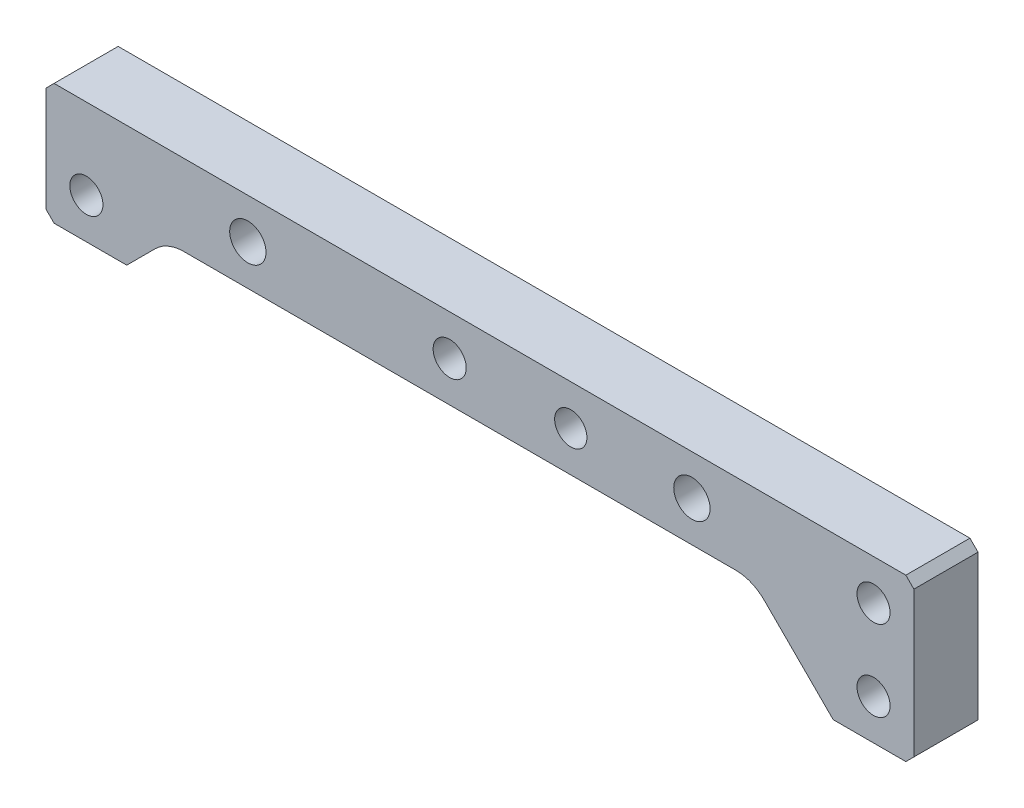
ISO-10303-21;
HEADER;
FILE_DESCRIPTION(('STEP AP214'),'2;1');
FILE_NAME('part.step','',(''),(''),'','','');
FILE_SCHEMA(('AUTOMOTIVE_DESIGN { 1 0 10303 214 1 1 1 1 }'));
ENDSEC;
DATA;
#1=APPLICATION_CONTEXT('core data for automotive mechanical design processes');
#2=APPLICATION_PROTOCOL_DEFINITION('international standard','automotive_design',2000,#1);
#3=PRODUCT_CONTEXT('',#1,'mechanical');
#4=PRODUCT('Part','Part','',(#3));
#5=PRODUCT_RELATED_PRODUCT_CATEGORY('part','',(#4));
#6=PRODUCT_DEFINITION_FORMATION('','',#4);
#7=PRODUCT_DEFINITION_CONTEXT('part definition',#1,'design');
#8=PRODUCT_DEFINITION('design','',#6,#7);
#9=PRODUCT_DEFINITION_SHAPE('','',#8);
#10=(LENGTH_UNIT() NAMED_UNIT(*) SI_UNIT(.MILLI.,.METRE.));
#11=(NAMED_UNIT(*) PLANE_ANGLE_UNIT() SI_UNIT($,.RADIAN.));
#12=(NAMED_UNIT(*) SI_UNIT($,.STERADIAN.) SOLID_ANGLE_UNIT());
#13=UNCERTAINTY_MEASURE_WITH_UNIT(LENGTH_MEASURE(1.E-05),#10,'distance_accuracy_value','');
#14=(GEOMETRIC_REPRESENTATION_CONTEXT(3) GLOBAL_UNCERTAINTY_ASSIGNED_CONTEXT((#13)) GLOBAL_UNIT_ASSIGNED_CONTEXT((#10,
#11,#12)) REPRESENTATION_CONTEXT('',''));
#15=CARTESIAN_POINT('',(0.,0.,0.));
#16=DIRECTION('',(0.,0.,1.));
#17=DIRECTION('',(1.,0.,0.));
#18=AXIS2_PLACEMENT_3D('',#15,#16,#17);
#19=CARTESIAN_POINT('',(0.,0.,15.875));
#20=DIRECTION('',(0.,0.,-1.));
#21=DIRECTION('',(-1.,0.,0.));
#22=AXIS2_PLACEMENT_3D('',#19,#20,#21);
#23=PLANE('',#22);
#24=CARTESIAN_POINT('',(-80.,0.,15.875));
#25=DIRECTION('',(0.,0.,-1.));
#26=DIRECTION('',(-1.,0.,0.));
#27=AXIS2_PLACEMENT_3D('',#24,#25,#26);
#28=CIRCLE('',#27,4.5);
#29=CARTESIAN_POINT('',(-84.5,0.,15.875));
#30=VERTEX_POINT('',#29);
#31=EDGE_CURVE('E616',#30,#30,#28,.T.);
#32=ORIENTED_EDGE('',*,*,#31,.T.);
#33=EDGE_LOOP('',(#32));
#34=FACE_BOUND('',#33,.T.);
#35=CARTESIAN_POINT('',(30.,0.,15.875));
#36=DIRECTION('',(0.,0.,-1.));
#37=DIRECTION('',(-1.,0.,0.));
#38=AXIS2_PLACEMENT_3D('',#35,#36,#37);
#39=CIRCLE('',#38,4.5);
#40=CARTESIAN_POINT('',(25.5,0.,15.875));
#41=VERTEX_POINT('',#40);
#42=EDGE_CURVE('E605',#41,#41,#39,.T.);
#43=ORIENTED_EDGE('',*,*,#42,.T.);
#44=EDGE_LOOP('',(#43));
#45=FACE_BOUND('',#44,.T.);
#46=DIRECTION('',(-1.,0.,0.));
#47=VECTOR('',#46,1.);
#48=CARTESIAN_POINT('',(0.,10.,15.875));
#49=LINE('',#48,#47);
#50=CARTESIAN_POINT('',(82.9999999999999,10.,15.875));
#51=VERTEX_POINT('',#50);
#52=CARTESIAN_POINT('',(-128.,9.99999999999994,15.875));
#53=VERTEX_POINT('',#52);
#54=EDGE_CURVE('E237',#51,#53,#49,.T.);
#55=ORIENTED_EDGE('',*,*,#54,.T.);
#56=DIRECTION('',(0.707106781186552,0.707106781186543,0.));
#57=VECTOR('',#56,1.);
#58=CARTESIAN_POINT('',(-130.,8.,15.875));
#59=LINE('',#58,#57);
#60=CARTESIAN_POINT('',(-130.,8.,15.875));
#61=VERTEX_POINT('',#60);
#62=EDGE_CURVE('E272',#53,#61,#59,.F.);
#63=ORIENTED_EDGE('',*,*,#62,.T.);
#64=DIRECTION('',(0.,-1.,0.));
#65=VECTOR('',#64,1.);
#66=CARTESIAN_POINT('',(-130.,10.,15.875));
#67=LINE('',#66,#65);
#68=CARTESIAN_POINT('',(-130.,-18.,15.875));
#69=VERTEX_POINT('',#68);
#70=EDGE_CURVE('E155',#61,#69,#67,.T.);
#71=ORIENTED_EDGE('',*,*,#70,.T.);
#72=DIRECTION('',(-0.707106781186552,0.707106781186543,0.));
#73=VECTOR('',#72,1.);
#74=CARTESIAN_POINT('',(-128.,-20.,15.875));
#75=LINE('',#74,#73);
#76=CARTESIAN_POINT('',(-128.,-20.,15.875));
#77=VERTEX_POINT('',#76);
#78=EDGE_CURVE('E149',#69,#77,#75,.F.);
#79=ORIENTED_EDGE('',*,*,#78,.T.);
#80=DIRECTION('',(1.,0.,0.));
#81=VECTOR('',#80,1.);
#82=CARTESIAN_POINT('',(-110.,-20.,15.875));
#83=LINE('',#82,#81);
#84=CARTESIAN_POINT('',(-110.,-20.,15.875));
#85=VERTEX_POINT('',#84);
#86=EDGE_CURVE('E140',#77,#85,#83,.T.);
#87=ORIENTED_EDGE('',*,*,#86,.T.);
#88=DIRECTION('',(-0.707106781186551,-0.707106781186544,0.));
#89=VECTOR('',#88,1.);
#90=CARTESIAN_POINT('',(-44.9999999999995,44.9999999999999,15.875));
#91=LINE('',#90,#89);
#92=CARTESIAN_POINT('',(-102.928932188134,-12.9289321881345,15.875));
#93=VERTEX_POINT('',#92);
#94=EDGE_CURVE('E145',#85,#93,#91,.F.);
#95=ORIENTED_EDGE('',*,*,#94,.T.);
#96=CARTESIAN_POINT('',(-95.857864376269,-20.,15.875));
#97=DIRECTION('',(0.,0.,-1.));
#98=DIRECTION('',(-1.,0.,0.));
#99=AXIS2_PLACEMENT_3D('',#96,#97,#98);
#100=CIRCLE('',#99,10.);
#101=CARTESIAN_POINT('',(-95.857864376269,-10.,15.875));
#102=VERTEX_POINT('',#101);
#103=EDGE_CURVE('E195',#93,#102,#100,.T.);
#104=ORIENTED_EDGE('',*,*,#103,.T.);
#105=DIRECTION('',(1.,0.,0.));
#106=VECTOR('',#105,1.);
#107=CARTESIAN_POINT('',(0.,-10.,15.875));
#108=LINE('',#107,#106);
#109=CARTESIAN_POINT('',(40.8578643762691,-10.,15.875));
#110=VERTEX_POINT('',#109);
#111=EDGE_CURVE('E154',#102,#110,#108,.T.);
#112=ORIENTED_EDGE('',*,*,#111,.T.);
#113=CARTESIAN_POINT('',(40.8578643762691,-20.,15.875));
#114=DIRECTION('',(0.,0.,-1.));
#115=DIRECTION('',(-1.,0.,0.));
#116=AXIS2_PLACEMENT_3D('',#113,#114,#115);
#117=CIRCLE('',#116,10.);
#118=CARTESIAN_POINT('',(47.9289321881346,-12.9289321881345,15.875));
#119=VERTEX_POINT('',#118);
#120=EDGE_CURVE('E50',#110,#119,#117,.T.);
#121=ORIENTED_EDGE('',*,*,#120,.T.);
#122=DIRECTION('',(-0.707106781186546,0.707106781186549,0.));
#123=VECTOR('',#122,1.);
#124=CARTESIAN_POINT('',(17.5000000000001,17.5,15.875));
#125=LINE('',#124,#123);
#126=CARTESIAN_POINT('',(65.,-30.,15.875));
#127=VERTEX_POINT('',#126);
#128=EDGE_CURVE('E181',#119,#127,#125,.F.);
#129=ORIENTED_EDGE('',*,*,#128,.T.);
#130=DIRECTION('',(1.,0.,0.));
#131=VECTOR('',#130,1.);
#132=CARTESIAN_POINT('',(85.,-30.,15.875));
#133=LINE('',#132,#131);
#134=CARTESIAN_POINT('',(83.,-30.,15.875));
#135=VERTEX_POINT('',#134);
#136=EDGE_CURVE('E207',#127,#135,#133,.T.);
#137=ORIENTED_EDGE('',*,*,#136,.T.);
#138=DIRECTION('',(-0.707106781186552,-0.707106781186543,0.));
#139=VECTOR('',#138,1.);
#140=CARTESIAN_POINT('',(85.,-28.,15.875));
#141=LINE('',#140,#139);
#142=CARTESIAN_POINT('',(85.,-28.,15.875));
#143=VERTEX_POINT('',#142);
#144=EDGE_CURVE('E267',#135,#143,#141,.F.);
#145=ORIENTED_EDGE('',*,*,#144,.T.);
#146=DIRECTION('',(0.,1.,0.));
#147=VECTOR('',#146,1.);
#148=CARTESIAN_POINT('',(85.,10.,15.875));
#149=LINE('',#148,#147);
#150=CARTESIAN_POINT('',(85.,8.,15.875));
#151=VERTEX_POINT('',#150);
#152=EDGE_CURVE('E300',#143,#151,#149,.T.);
#153=ORIENTED_EDGE('',*,*,#152,.T.);
#154=DIRECTION('',(0.707106781186548,-0.707106781186548,0.));
#155=VECTOR('',#154,1.);
#156=CARTESIAN_POINT('',(82.9999999999999,10.,15.875));
#157=LINE('',#156,#155);
#158=EDGE_CURVE('E264',#151,#51,#157,.F.);
#159=ORIENTED_EDGE('',*,*,#158,.T.);
#160=EDGE_LOOP('',(#55,#63,#71,#79,#87,#95,#104,#112,#121,#129,#137,#145,#153,#159));
#161=FACE_BOUND('',#160,.T.);
#162=CARTESIAN_POINT('',(0.,0.,15.875));
#163=DIRECTION('',(0.,0.,1.));
#164=DIRECTION('',(1.,0.,0.));
#165=AXIS2_PLACEMENT_3D('',#162,#163,#164);
#166=CIRCLE('',#165,4.);
#167=CARTESIAN_POINT('',(4.,0.,15.875));
#168=VERTEX_POINT('',#167);
#169=EDGE_CURVE('E545',#168,#168,#166,.T.);
#170=ORIENTED_EDGE('',*,*,#169,.F.);
#171=EDGE_LOOP('',(#170));
#172=FACE_BOUND('',#171,.T.);
#173=CARTESIAN_POINT('',(-30.,0.,15.875));
#174=DIRECTION('',(0.,0.,1.));
#175=DIRECTION('',(1.,0.,0.));
#176=AXIS2_PLACEMENT_3D('',#173,#174,#175);
#177=CIRCLE('',#176,4.1);
#178=CARTESIAN_POINT('',(-25.9,0.,15.875));
#179=VERTEX_POINT('',#178);
#180=EDGE_CURVE('E550',#179,#179,#177,.T.);
#181=ORIENTED_EDGE('',*,*,#180,.F.);
#182=EDGE_LOOP('',(#181));
#183=FACE_BOUND('',#182,.T.);
#184=CARTESIAN_POINT('',(-120.,-10.,15.875));
#185=DIRECTION('',(0.,0.,1.));
#186=DIRECTION('',(1.,0.,0.));
#187=AXIS2_PLACEMENT_3D('',#184,#185,#186);
#188=CIRCLE('',#187,4.09999999999999);
#189=CARTESIAN_POINT('',(-115.9,-10.,15.875));
#190=VERTEX_POINT('',#189);
#191=EDGE_CURVE('E583',#190,#190,#188,.T.);
#192=ORIENTED_EDGE('',*,*,#191,.F.);
#193=EDGE_LOOP('',(#192));
#194=FACE_BOUND('',#193,.T.);
#195=CARTESIAN_POINT('',(75.,0.,15.875));
#196=DIRECTION('',(0.,0.,1.));
#197=DIRECTION('',(1.,0.,0.));
#198=AXIS2_PLACEMENT_3D('',#195,#196,#197);
#199=CIRCLE('',#198,4.1);
#200=CARTESIAN_POINT('',(79.1,0.,15.875));
#201=VERTEX_POINT('',#200);
#202=EDGE_CURVE('E589',#201,#201,#199,.T.);
#203=ORIENTED_EDGE('',*,*,#202,.F.);
#204=EDGE_LOOP('',(#203));
#205=FACE_BOUND('',#204,.T.);
#206=CARTESIAN_POINT('',(75.,-20.,15.875));
#207=DIRECTION('',(0.,0.,1.));
#208=DIRECTION('',(1.,0.,0.));
#209=AXIS2_PLACEMENT_3D('',#206,#207,#208);
#210=CIRCLE('',#209,4.1);
#211=CARTESIAN_POINT('',(79.1,-20.,15.875));
#212=VERTEX_POINT('',#211);
#213=EDGE_CURVE('E597',#212,#212,#210,.T.);
#214=ORIENTED_EDGE('',*,*,#213,.F.);
#215=EDGE_LOOP('',(#214));
#216=FACE_BOUND('',#215,.T.);
#217=ADVANCED_FACE('F41',(#34,#45,#161,#172,#183,#194,#205,#216),#23,.F.);
#218=CARTESIAN_POINT('',(0.,0.,0.));
#219=DIRECTION('',(0.,0.,-1.));
#220=DIRECTION('',(-1.,0.,0.));
#221=AXIS2_PLACEMENT_3D('',#218,#219,#220);
#222=PLANE('',#221);
#223=CARTESIAN_POINT('',(-80.,0.,0.));
#224=DIRECTION('',(0.,0.,-1.));
#225=DIRECTION('',(-1.,0.,0.));
#226=AXIS2_PLACEMENT_3D('',#223,#224,#225);
#227=CIRCLE('',#226,4.5);
#228=CARTESIAN_POINT('',(-84.5,0.,0.));
#229=VERTEX_POINT('',#228);
#230=EDGE_CURVE('E619',#229,#229,#227,.T.);
#231=ORIENTED_EDGE('',*,*,#230,.F.);
#232=EDGE_LOOP('',(#231));
#233=FACE_BOUND('',#232,.T.);
#234=CARTESIAN_POINT('',(30.,0.,0.));
#235=DIRECTION('',(0.,0.,-1.));
#236=DIRECTION('',(-1.,0.,0.));
#237=AXIS2_PLACEMENT_3D('',#234,#235,#236);
#238=CIRCLE('',#237,4.5);
#239=CARTESIAN_POINT('',(25.5,0.,0.));
#240=VERTEX_POINT('',#239);
#241=EDGE_CURVE('E612',#240,#240,#238,.T.);
#242=ORIENTED_EDGE('',*,*,#241,.F.);
#243=EDGE_LOOP('',(#242));
#244=FACE_BOUND('',#243,.T.);
#245=CARTESIAN_POINT('',(75.,0.,0.));
#246=DIRECTION('',(0.,0.,1.));
#247=DIRECTION('',(1.,0.,0.));
#248=AXIS2_PLACEMENT_3D('',#245,#246,#247);
#249=CIRCLE('',#248,4.1);
#250=CARTESIAN_POINT('',(79.1,0.,0.));
#251=VERTEX_POINT('',#250);
#252=EDGE_CURVE('E593',#251,#251,#249,.T.);
#253=ORIENTED_EDGE('',*,*,#252,.T.);
#254=EDGE_LOOP('',(#253));
#255=FACE_BOUND('',#254,.T.);
#256=CARTESIAN_POINT('',(-30.,0.,0.));
#257=DIRECTION('',(0.,0.,1.));
#258=DIRECTION('',(1.,0.,0.));
#259=AXIS2_PLACEMENT_3D('',#256,#257,#258);
#260=CIRCLE('',#259,4.1);
#261=CARTESIAN_POINT('',(-25.9,0.,0.));
#262=VERTEX_POINT('',#261);
#263=EDGE_CURVE('E556',#262,#262,#260,.T.);
#264=ORIENTED_EDGE('',*,*,#263,.T.);
#265=EDGE_LOOP('',(#264));
#266=FACE_BOUND('',#265,.T.);
#267=DIRECTION('',(0.,-1.,0.));
#268=VECTOR('',#267,1.);
#269=CARTESIAN_POINT('',(-130.,10.,0.));
#270=LINE('',#269,#268);
#271=CARTESIAN_POINT('',(-130.,8.,0.));
#272=VERTEX_POINT('',#271);
#273=CARTESIAN_POINT('',(-130.,-18.,0.));
#274=VERTEX_POINT('',#273);
#275=EDGE_CURVE('E224',#272,#274,#270,.T.);
#276=ORIENTED_EDGE('',*,*,#275,.F.);
#277=DIRECTION('',(-0.707106781186552,-0.707106781186543,0.));
#278=VECTOR('',#277,1.);
#279=CARTESIAN_POINT('',(-68.9999999999991,69.0000000000001,0.));
#280=LINE('',#279,#278);
#281=CARTESIAN_POINT('',(-128.,10.,0.));
#282=VERTEX_POINT('',#281);
#283=EDGE_CURVE('E254',#272,#282,#280,.F.);
#284=ORIENTED_EDGE('',*,*,#283,.T.);
#285=DIRECTION('',(-1.,0.,0.));
#286=VECTOR('',#285,1.);
#287=CARTESIAN_POINT('',(0.,10.,0.));
#288=LINE('',#287,#286);
#289=CARTESIAN_POINT('',(82.9999999999999,10.,0.));
#290=VERTEX_POINT('',#289);
#291=EDGE_CURVE('E231',#290,#282,#288,.T.);
#292=ORIENTED_EDGE('',*,*,#291,.F.);
#293=DIRECTION('',(-0.707106781186548,0.707106781186548,0.));
#294=VECTOR('',#293,1.);
#295=CARTESIAN_POINT('',(46.5,46.5,0.));
#296=LINE('',#295,#294);
#297=CARTESIAN_POINT('',(85.,8.,0.));
#298=VERTEX_POINT('',#297);
#299=EDGE_CURVE('E245',#290,#298,#296,.F.);
#300=ORIENTED_EDGE('',*,*,#299,.T.);
#301=DIRECTION('',(0.,1.,0.));
#302=VECTOR('',#301,1.);
#303=CARTESIAN_POINT('',(85.,10.,0.));
#304=LINE('',#303,#302);
#305=CARTESIAN_POINT('',(85.,-28.,0.));
#306=VERTEX_POINT('',#305);
#307=EDGE_CURVE('E222',#306,#298,#304,.T.);
#308=ORIENTED_EDGE('',*,*,#307,.F.);
#309=DIRECTION('',(0.707106781186552,0.707106781186543,0.));
#310=VECTOR('',#309,1.);
#311=CARTESIAN_POINT('',(56.4999999999994,-56.5000000000002,0.));
#312=LINE('',#311,#310);
#313=CARTESIAN_POINT('',(83.,-30.,0.));
#314=VERTEX_POINT('',#313);
#315=EDGE_CURVE('E248',#306,#314,#312,.F.);
#316=ORIENTED_EDGE('',*,*,#315,.T.);
#317=DIRECTION('',(1.,0.,0.));
#318=VECTOR('',#317,1.);
#319=CARTESIAN_POINT('',(85.,-30.,0.));
#320=LINE('',#319,#318);
#321=CARTESIAN_POINT('',(65.,-30.,0.));
#322=VERTEX_POINT('',#321);
#323=EDGE_CURVE('E217',#322,#314,#320,.T.);
#324=ORIENTED_EDGE('',*,*,#323,.F.);
#325=DIRECTION('',(0.707106781186546,-0.707106781186549,0.));
#326=VECTOR('',#325,1.);
#327=CARTESIAN_POINT('',(65.,-30.,0.));
#328=LINE('',#327,#326);
#329=CARTESIAN_POINT('',(47.9289321881346,-12.9289321881345,0.));
#330=VERTEX_POINT('',#329);
#331=EDGE_CURVE('E288',#322,#330,#328,.F.);
#332=ORIENTED_EDGE('',*,*,#331,.T.);
#333=CARTESIAN_POINT('',(40.8578643762691,-20.,0.));
#334=DIRECTION('',(0.,0.,-1.));
#335=DIRECTION('',(-1.,0.,0.));
#336=AXIS2_PLACEMENT_3D('',#333,#334,#335);
#337=CIRCLE('',#336,10.);
#338=CARTESIAN_POINT('',(40.8578643762691,-10.,0.));
#339=VERTEX_POINT('',#338);
#340=EDGE_CURVE('E11',#330,#339,#337,.F.);
#341=ORIENTED_EDGE('',*,*,#340,.T.);
#342=DIRECTION('',(1.,0.,0.));
#343=VECTOR('',#342,1.);
#344=CARTESIAN_POINT('',(65.,-10.,0.));
#345=LINE('',#344,#343);
#346=CARTESIAN_POINT('',(-95.857864376269,-9.99999999999999,0.));
#347=VERTEX_POINT('',#346);
#348=EDGE_CURVE('E214',#347,#339,#345,.T.);
#349=ORIENTED_EDGE('',*,*,#348,.F.);
#350=CARTESIAN_POINT('',(-95.857864376269,-20.,0.));
#351=DIRECTION('',(0.,0.,-1.));
#352=DIRECTION('',(-1.,0.,0.));
#353=AXIS2_PLACEMENT_3D('',#350,#351,#352);
#354=CIRCLE('',#353,10.);
#355=CARTESIAN_POINT('',(-102.928932188134,-12.9289321881345,0.));
#356=VERTEX_POINT('',#355);
#357=EDGE_CURVE('E192',#347,#356,#354,.F.);
#358=ORIENTED_EDGE('',*,*,#357,.T.);
#359=DIRECTION('',(0.707106781186551,0.707106781186544,0.));
#360=VECTOR('',#359,1.);
#361=CARTESIAN_POINT('',(-99.9999999999999,-9.99999999999999,0.));
#362=LINE('',#361,#360);
#363=CARTESIAN_POINT('',(-110.,-20.,0.));
#364=VERTEX_POINT('',#363);
#365=EDGE_CURVE('E174',#356,#364,#362,.F.);
#366=ORIENTED_EDGE('',*,*,#365,.T.);
#367=DIRECTION('',(1.,0.,0.));
#368=VECTOR('',#367,1.);
#369=CARTESIAN_POINT('',(-110.,-20.,0.));
#370=LINE('',#369,#368);
#371=CARTESIAN_POINT('',(-128.,-20.,0.));
#372=VERTEX_POINT('',#371);
#373=EDGE_CURVE('E162',#372,#364,#370,.T.);
#374=ORIENTED_EDGE('',*,*,#373,.F.);
#375=DIRECTION('',(0.707106781186552,-0.707106781186543,0.));
#376=VECTOR('',#375,1.);
#377=CARTESIAN_POINT('',(-73.9999999999991,-74.0000000000001,0.));
#378=LINE('',#377,#376);
#379=EDGE_CURVE('E251',#372,#274,#378,.F.);
#380=ORIENTED_EDGE('',*,*,#379,.T.);
#381=EDGE_LOOP('',(#276,#284,#292,#300,#308,#316,#324,#332,#341,#349,#358,#366,#374,#380));
#382=FACE_BOUND('',#381,.T.);
#383=CARTESIAN_POINT('',(0.,0.,0.));
#384=DIRECTION('',(0.,0.,1.));
#385=DIRECTION('',(1.,0.,0.));
#386=AXIS2_PLACEMENT_3D('',#383,#384,#385);
#387=CIRCLE('',#386,4.);
#388=CARTESIAN_POINT('',(4.,0.,0.));
#389=VERTEX_POINT('',#388);
#390=EDGE_CURVE('E548',#389,#389,#387,.T.);
#391=ORIENTED_EDGE('',*,*,#390,.T.);
#392=EDGE_LOOP('',(#391));
#393=FACE_BOUND('',#392,.T.);
#394=CARTESIAN_POINT('',(-120.,-10.,0.));
#395=DIRECTION('',(0.,0.,1.));
#396=DIRECTION('',(1.,0.,0.));
#397=AXIS2_PLACEMENT_3D('',#394,#395,#396);
#398=CIRCLE('',#397,4.09999999999999);
#399=CARTESIAN_POINT('',(-115.9,-10.,0.));
#400=VERTEX_POINT('',#399);
#401=EDGE_CURVE('E585',#400,#400,#398,.T.);
#402=ORIENTED_EDGE('',*,*,#401,.T.);
#403=EDGE_LOOP('',(#402));
#404=FACE_BOUND('',#403,.T.);
#405=CARTESIAN_POINT('',(75.,-20.,0.));
#406=DIRECTION('',(0.,0.,1.));
#407=DIRECTION('',(1.,0.,0.));
#408=AXIS2_PLACEMENT_3D('',#405,#406,#407);
#409=CIRCLE('',#408,4.1);
#410=CARTESIAN_POINT('',(79.1,-20.,0.));
#411=VERTEX_POINT('',#410);
#412=EDGE_CURVE('E601',#411,#411,#409,.T.);
#413=ORIENTED_EDGE('',*,*,#412,.T.);
#414=EDGE_LOOP('',(#413));
#415=FACE_BOUND('',#414,.T.);
#416=ADVANCED_FACE('F212',(#233,#244,#255,#266,#382,#393,#404,#415),#222,.T.);
#417=CARTESIAN_POINT('',(-130.,10.,15.875));
#418=DIRECTION('',(1.,0.,0.));
#419=DIRECTION('',(0.,0.,-1.));
#420=AXIS2_PLACEMENT_3D('',#417,#418,#419);
#421=PLANE('',#420);
#422=ORIENTED_EDGE('',*,*,#70,.F.);
#423=DIRECTION('',(0.,0.,-1.));
#424=VECTOR('',#423,1.);
#425=CARTESIAN_POINT('',(-130.,8.,15.875));
#426=LINE('',#425,#424);
#427=EDGE_CURVE('E241',#61,#272,#426,.T.);
#428=ORIENTED_EDGE('',*,*,#427,.T.);
#429=ORIENTED_EDGE('',*,*,#275,.T.);
#430=DIRECTION('',(0.,0.,1.));
#431=VECTOR('',#430,1.);
#432=CARTESIAN_POINT('',(-130.,-18.,15.875));
#433=LINE('',#432,#431);
#434=EDGE_CURVE('E166',#274,#69,#433,.T.);
#435=ORIENTED_EDGE('',*,*,#434,.T.);
#436=EDGE_LOOP('',(#422,#428,#429,#435));
#437=FACE_BOUND('',#436,.T.);
#438=ADVANCED_FACE('F314',(#437),#421,.F.);
#439=CARTESIAN_POINT('',(-110.,-20.,15.875));
#440=DIRECTION('',(0.,1.,0.));
#441=DIRECTION('',(0.,0.,1.));
#442=AXIS2_PLACEMENT_3D('',#439,#440,#441);
#443=PLANE('',#442);
#444=ORIENTED_EDGE('',*,*,#86,.F.);
#445=DIRECTION('',(0.,0.,-1.));
#446=VECTOR('',#445,1.);
#447=CARTESIAN_POINT('',(-128.,-20.,15.875));
#448=LINE('',#447,#446);
#449=EDGE_CURVE('E275',#77,#372,#448,.T.);
#450=ORIENTED_EDGE('',*,*,#449,.T.);
#451=ORIENTED_EDGE('',*,*,#373,.T.);
#452=DIRECTION('',(0.,0.,-1.));
#453=VECTOR('',#452,1.);
#454=CARTESIAN_POINT('',(-110.,-20.,15.875));
#455=LINE('',#454,#453);
#456=EDGE_CURVE('E159',#85,#364,#455,.T.);
#457=ORIENTED_EDGE('',*,*,#456,.F.);
#458=EDGE_LOOP('',(#444,#450,#451,#457));
#459=FACE_BOUND('',#458,.T.);
#460=ADVANCED_FACE('F160',(#459),#443,.F.);
#461=CARTESIAN_POINT('',(65.,-10.,15.875));
#462=DIRECTION('',(0.,1.,0.));
#463=DIRECTION('',(-1.,0.,0.));
#464=AXIS2_PLACEMENT_3D('',#461,#462,#463);
#465=PLANE('',#464);
#466=ORIENTED_EDGE('',*,*,#111,.F.);
#467=DIRECTION('',(0.,0.,1.));
#468=VECTOR('',#467,1.);
#469=CARTESIAN_POINT('',(-95.857864376269,-9.99999999999999,0.));
#470=LINE('',#469,#468);
#471=EDGE_CURVE('E179',#102,#347,#470,.F.);
#472=ORIENTED_EDGE('',*,*,#471,.T.);
#473=ORIENTED_EDGE('',*,*,#348,.T.);
#474=DIRECTION('',(0.,0.,-1.));
#475=VECTOR('',#474,1.);
#476=CARTESIAN_POINT('',(40.8578643762691,-10.,15.875));
#477=LINE('',#476,#475);
#478=EDGE_CURVE('E173',#339,#110,#477,.F.);
#479=ORIENTED_EDGE('',*,*,#478,.T.);
#480=EDGE_LOOP('',(#466,#472,#473,#479));
#481=FACE_BOUND('',#480,.T.);
#482=ADVANCED_FACE('F202',(#481),#465,.F.);
#483=CARTESIAN_POINT('',(85.,-30.,15.875));
#484=DIRECTION('',(0.,1.,0.));
#485=DIRECTION('',(-1.,0.,0.));
#486=AXIS2_PLACEMENT_3D('',#483,#484,#485);
#487=PLANE('',#486);
#488=ORIENTED_EDGE('',*,*,#323,.T.);
#489=DIRECTION('',(0.,0.,1.));
#490=VECTOR('',#489,1.);
#491=CARTESIAN_POINT('',(83.,-30.,15.875));
#492=LINE('',#491,#490);
#493=EDGE_CURVE('E285',#314,#135,#492,.T.);
#494=ORIENTED_EDGE('',*,*,#493,.T.);
#495=ORIENTED_EDGE('',*,*,#136,.F.);
#496=DIRECTION('',(0.,0.,-1.));
#497=VECTOR('',#496,1.);
#498=CARTESIAN_POINT('',(65.,-30.,15.875));
#499=LINE('',#498,#497);
#500=EDGE_CURVE('E167',#127,#322,#499,.T.);
#501=ORIENTED_EDGE('',*,*,#500,.T.);
#502=EDGE_LOOP('',(#488,#494,#495,#501));
#503=FACE_BOUND('',#502,.T.);
#504=ADVANCED_FACE('F296',(#503),#487,.F.);
#505=CARTESIAN_POINT('',(85.,10.,15.875));
#506=DIRECTION('',(-1.,0.,0.));
#507=DIRECTION('',(0.,-1.,0.));
#508=AXIS2_PLACEMENT_3D('',#505,#506,#507);
#509=PLANE('',#508);
#510=ORIENTED_EDGE('',*,*,#152,.F.);
#511=DIRECTION('',(0.,0.,-1.));
#512=VECTOR('',#511,1.);
#513=CARTESIAN_POINT('',(85.,-28.,15.875));
#514=LINE('',#513,#512);
#515=EDGE_CURVE('E281',#143,#306,#514,.T.);
#516=ORIENTED_EDGE('',*,*,#515,.T.);
#517=ORIENTED_EDGE('',*,*,#307,.T.);
#518=DIRECTION('',(0.,0.,1.));
#519=VECTOR('',#518,1.);
#520=CARTESIAN_POINT('',(85.,8.,15.875));
#521=LINE('',#520,#519);
#522=EDGE_CURVE('E278',#298,#151,#521,.T.);
#523=ORIENTED_EDGE('',*,*,#522,.T.);
#524=EDGE_LOOP('',(#510,#516,#517,#523));
#525=FACE_BOUND('',#524,.T.);
#526=ADVANCED_FACE('F326',(#525),#509,.F.);
#527=CARTESIAN_POINT('',(0.,10.,15.875));
#528=DIRECTION('',(0.,-1.,0.));
#529=DIRECTION('',(0.,0.,-1.));
#530=AXIS2_PLACEMENT_3D('',#527,#528,#529);
#531=PLANE('',#530);
#532=ORIENTED_EDGE('',*,*,#291,.T.);
#533=DIRECTION('',(0.,0.,1.));
#534=VECTOR('',#533,1.);
#535=CARTESIAN_POINT('',(-128.,10.,15.875));
#536=LINE('',#535,#534);
#537=EDGE_CURVE('E261',#282,#53,#536,.T.);
#538=ORIENTED_EDGE('',*,*,#537,.T.);
#539=ORIENTED_EDGE('',*,*,#54,.F.);
#540=DIRECTION('',(0.,0.,-1.));
#541=VECTOR('',#540,1.);
#542=CARTESIAN_POINT('',(82.9999999999999,10.,15.875));
#543=LINE('',#542,#541);
#544=EDGE_CURVE('E257',#51,#290,#543,.T.);
#545=ORIENTED_EDGE('',*,*,#544,.T.);
#546=EDGE_LOOP('',(#532,#538,#539,#545));
#547=FACE_BOUND('',#546,.T.);
#548=ADVANCED_FACE('F323',(#547),#531,.F.);
#549=CARTESIAN_POINT('',(0.,0.,15.875));
#550=DIRECTION('',(0.,0.,-1.));
#551=DIRECTION('',(-1.,0.,0.));
#552=AXIS2_PLACEMENT_3D('',#549,#550,#551);
#553=CYLINDRICAL_SURFACE('',#552,4.);
#554=ORIENTED_EDGE('',*,*,#169,.T.);
#555=EDGE_LOOP('',(#554));
#556=FACE_BOUND('',#555,.T.);
#557=ORIENTED_EDGE('',*,*,#390,.F.);
#558=EDGE_LOOP('',(#557));
#559=FACE_BOUND('',#558,.T.);
#560=ADVANCED_FACE('F320',(#556,#559),#553,.F.);
#561=CARTESIAN_POINT('',(-30.,0.,15.875));
#562=DIRECTION('',(0.,0.,-1.));
#563=DIRECTION('',(-1.,0.,0.));
#564=AXIS2_PLACEMENT_3D('',#561,#562,#563);
#565=CYLINDRICAL_SURFACE('',#564,4.1);
#566=ORIENTED_EDGE('',*,*,#180,.T.);
#567=EDGE_LOOP('',(#566));
#568=FACE_BOUND('',#567,.T.);
#569=ORIENTED_EDGE('',*,*,#263,.F.);
#570=EDGE_LOOP('',(#569));
#571=FACE_BOUND('',#570,.T.);
#572=ADVANCED_FACE('F466',(#568,#571),#565,.F.);
#573=CARTESIAN_POINT('',(-120.,-10.,15.875));
#574=DIRECTION('',(0.,0.,-1.));
#575=DIRECTION('',(-1.,0.,0.));
#576=AXIS2_PLACEMENT_3D('',#573,#574,#575);
#577=CYLINDRICAL_SURFACE('',#576,4.09999999999999);
#578=ORIENTED_EDGE('',*,*,#191,.T.);
#579=EDGE_LOOP('',(#578));
#580=FACE_BOUND('',#579,.T.);
#581=ORIENTED_EDGE('',*,*,#401,.F.);
#582=EDGE_LOOP('',(#581));
#583=FACE_BOUND('',#582,.T.);
#584=ADVANCED_FACE('F457',(#580,#583),#577,.F.);
#585=CARTESIAN_POINT('',(75.,0.,15.875));
#586=DIRECTION('',(0.,0.,-1.));
#587=DIRECTION('',(-1.,0.,0.));
#588=AXIS2_PLACEMENT_3D('',#585,#586,#587);
#589=CYLINDRICAL_SURFACE('',#588,4.1);
#590=ORIENTED_EDGE('',*,*,#202,.T.);
#591=EDGE_LOOP('',(#590));
#592=FACE_BOUND('',#591,.T.);
#593=ORIENTED_EDGE('',*,*,#252,.F.);
#594=EDGE_LOOP('',(#593));
#595=FACE_BOUND('',#594,.T.);
#596=ADVANCED_FACE('F447',(#592,#595),#589,.F.);
#597=CARTESIAN_POINT('',(75.,-20.,15.875));
#598=DIRECTION('',(0.,0.,-1.));
#599=DIRECTION('',(-1.,0.,0.));
#600=AXIS2_PLACEMENT_3D('',#597,#598,#599);
#601=CYLINDRICAL_SURFACE('',#600,4.1);
#602=ORIENTED_EDGE('',*,*,#213,.T.);
#603=EDGE_LOOP('',(#602));
#604=FACE_BOUND('',#603,.T.);
#605=ORIENTED_EDGE('',*,*,#412,.F.);
#606=EDGE_LOOP('',(#605));
#607=FACE_BOUND('',#606,.T.);
#608=ADVANCED_FACE('F348',(#604,#607),#601,.F.);
#609=CARTESIAN_POINT('',(-130.,8.,15.875));
#610=DIRECTION('',(0.707106781186542,-0.707106781186552,0.));
#611=DIRECTION('',(0.,0.,-1.));
#612=AXIS2_PLACEMENT_3D('',#609,#610,#611);
#613=PLANE('',#612);
#614=ORIENTED_EDGE('',*,*,#62,.F.);
#615=ORIENTED_EDGE('',*,*,#537,.F.);
#616=ORIENTED_EDGE('',*,*,#283,.F.);
#617=ORIENTED_EDGE('',*,*,#427,.F.);
#618=EDGE_LOOP('',(#614,#615,#616,#617));
#619=FACE_BOUND('',#618,.T.);
#620=ADVANCED_FACE('F341',(#619),#613,.F.);
#621=CARTESIAN_POINT('',(-128.,-20.,15.875));
#622=DIRECTION('',(0.707106781186542,0.707106781186552,0.));
#623=DIRECTION('',(0.,0.,-1.));
#624=AXIS2_PLACEMENT_3D('',#621,#622,#623);
#625=PLANE('',#624);
#626=ORIENTED_EDGE('',*,*,#78,.F.);
#627=ORIENTED_EDGE('',*,*,#434,.F.);
#628=ORIENTED_EDGE('',*,*,#379,.F.);
#629=ORIENTED_EDGE('',*,*,#449,.F.);
#630=EDGE_LOOP('',(#626,#627,#628,#629));
#631=FACE_BOUND('',#630,.T.);
#632=ADVANCED_FACE('F347',(#631),#625,.F.);
#633=CARTESIAN_POINT('',(85.,-28.,15.875));
#634=DIRECTION('',(-0.707106781186543,0.707106781186552,0.));
#635=DIRECTION('',(0.,0.,-1.));
#636=AXIS2_PLACEMENT_3D('',#633,#634,#635);
#637=PLANE('',#636);
#638=ORIENTED_EDGE('',*,*,#144,.F.);
#639=ORIENTED_EDGE('',*,*,#493,.F.);
#640=ORIENTED_EDGE('',*,*,#315,.F.);
#641=ORIENTED_EDGE('',*,*,#515,.F.);
#642=EDGE_LOOP('',(#638,#639,#640,#641));
#643=FACE_BOUND('',#642,.T.);
#644=ADVANCED_FACE('F355',(#643),#637,.F.);
#645=CARTESIAN_POINT('',(82.9999999999999,10.,15.875));
#646=DIRECTION('',(-0.707106781186547,-0.707106781186547,0.));
#647=DIRECTION('',(0.,0.,-1.));
#648=AXIS2_PLACEMENT_3D('',#645,#646,#647);
#649=PLANE('',#648);
#650=ORIENTED_EDGE('',*,*,#158,.F.);
#651=ORIENTED_EDGE('',*,*,#522,.F.);
#652=ORIENTED_EDGE('',*,*,#299,.F.);
#653=ORIENTED_EDGE('',*,*,#544,.F.);
#654=EDGE_LOOP('',(#650,#651,#652,#653));
#655=FACE_BOUND('',#654,.T.);
#656=ADVANCED_FACE('F362',(#655),#649,.F.);
#657=CARTESIAN_POINT('',(30.,0.,20.));
#658=DIRECTION('',(0.,0.,-1.));
#659=DIRECTION('',(-1.,0.,0.));
#660=AXIS2_PLACEMENT_3D('',#657,#658,#659);
#661=CYLINDRICAL_SURFACE('',#660,4.5);
#662=ORIENTED_EDGE('',*,*,#241,.T.);
#663=EDGE_LOOP('',(#662));
#664=FACE_BOUND('',#663,.T.);
#665=ORIENTED_EDGE('',*,*,#42,.F.);
#666=EDGE_LOOP('',(#665));
#667=FACE_BOUND('',#666,.T.);
#668=ADVANCED_FACE('F369',(#664,#667),#661,.F.);
#669=CARTESIAN_POINT('',(-80.,0.,20.));
#670=DIRECTION('',(0.,0.,-1.));
#671=DIRECTION('',(-1.,0.,0.));
#672=AXIS2_PLACEMENT_3D('',#669,#670,#671);
#673=CYLINDRICAL_SURFACE('',#672,4.5);
#674=ORIENTED_EDGE('',*,*,#230,.T.);
#675=EDGE_LOOP('',(#674));
#676=FACE_BOUND('',#675,.T.);
#677=ORIENTED_EDGE('',*,*,#31,.F.);
#678=EDGE_LOOP('',(#677));
#679=FACE_BOUND('',#678,.T.);
#680=ADVANCED_FACE('F376',(#676,#679),#673,.F.);
#681=CARTESIAN_POINT('',(65.,-30.,15.875));
#682=DIRECTION('',(-0.707106781186549,-0.707106781186546,0.));
#683=DIRECTION('',(0.,0.,1.));
#684=AXIS2_PLACEMENT_3D('',#681,#682,#683);
#685=PLANE('',#684);
#686=ORIENTED_EDGE('',*,*,#128,.F.);
#687=DIRECTION('',(0.,0.,1.));
#688=VECTOR('',#687,1.);
#689=CARTESIAN_POINT('',(47.9289321881346,-12.9289321881345,0.));
#690=LINE('',#689,#688);
#691=EDGE_CURVE('E57',#119,#330,#690,.F.);
#692=ORIENTED_EDGE('',*,*,#691,.T.);
#693=ORIENTED_EDGE('',*,*,#331,.F.);
#694=ORIENTED_EDGE('',*,*,#500,.F.);
#695=EDGE_LOOP('',(#686,#692,#693,#694));
#696=FACE_BOUND('',#695,.T.);
#697=ADVANCED_FACE('F302',(#696),#685,.T.);
#698=CARTESIAN_POINT('',(-99.9999999999999,-9.99999999999999,15.875));
#699=DIRECTION('',(0.707106781186544,-0.707106781186551,0.));
#700=DIRECTION('',(0.,0.,1.));
#701=AXIS2_PLACEMENT_3D('',#698,#699,#700);
#702=PLANE('',#701);
#703=ORIENTED_EDGE('',*,*,#365,.F.);
#704=DIRECTION('',(0.,0.,-1.));
#705=VECTOR('',#704,1.);
#706=CARTESIAN_POINT('',(-102.928932188134,-12.9289321881345,15.875));
#707=LINE('',#706,#705);
#708=EDGE_CURVE('E171',#356,#93,#707,.F.);
#709=ORIENTED_EDGE('',*,*,#708,.T.);
#710=ORIENTED_EDGE('',*,*,#94,.F.);
#711=ORIENTED_EDGE('',*,*,#456,.T.);
#712=EDGE_LOOP('',(#703,#709,#710,#711));
#713=FACE_BOUND('',#712,.T.);
#714=ADVANCED_FACE('F169',(#713),#702,.T.);
#715=CARTESIAN_POINT('',(-95.857864376269,-20.,15.875));
#716=DIRECTION('',(0.,0.,-1.));
#717=DIRECTION('',(-1.,0.,0.));
#718=AXIS2_PLACEMENT_3D('',#715,#716,#717);
#719=CYLINDRICAL_SURFACE('',#718,10.);
#720=ORIENTED_EDGE('',*,*,#103,.F.);
#721=ORIENTED_EDGE('',*,*,#708,.F.);
#722=ORIENTED_EDGE('',*,*,#357,.F.);
#723=ORIENTED_EDGE('',*,*,#471,.F.);
#724=EDGE_LOOP('',(#720,#721,#722,#723));
#725=FACE_BOUND('',#724,.T.);
#726=ADVANCED_FACE('F209',(#725),#719,.F.);
#727=CARTESIAN_POINT('',(40.8578643762691,-20.,15.875));
#728=DIRECTION('',(0.,0.,1.));
#729=DIRECTION('',(1.,0.,0.));
#730=AXIS2_PLACEMENT_3D('',#727,#728,#729);
#731=CYLINDRICAL_SURFACE('',#730,10.);
#732=ORIENTED_EDGE('',*,*,#340,.F.);
#733=ORIENTED_EDGE('',*,*,#691,.F.);
#734=ORIENTED_EDGE('',*,*,#120,.F.);
#735=ORIENTED_EDGE('',*,*,#478,.F.);
#736=EDGE_LOOP('',(#732,#733,#734,#735));
#737=FACE_BOUND('',#736,.T.);
#738=ADVANCED_FACE('F43',(#737),#731,.F.);
#739=CLOSED_SHELL('',(#217,#416,#438,#460,#482,#504,#526,#548,#560,#572,#584,#596,#608,#620,
#632,#644,#656,#668,#680,#697,#714,#726,#738));
#740=MANIFOLD_SOLID_BREP('B2',#739);
#741=ADVANCED_BREP_SHAPE_REPRESENTATION('',(#18,#740),#14);
#742=SHAPE_DEFINITION_REPRESENTATION(#9,#741);
ENDSEC;
END-ISO-10303-21;
